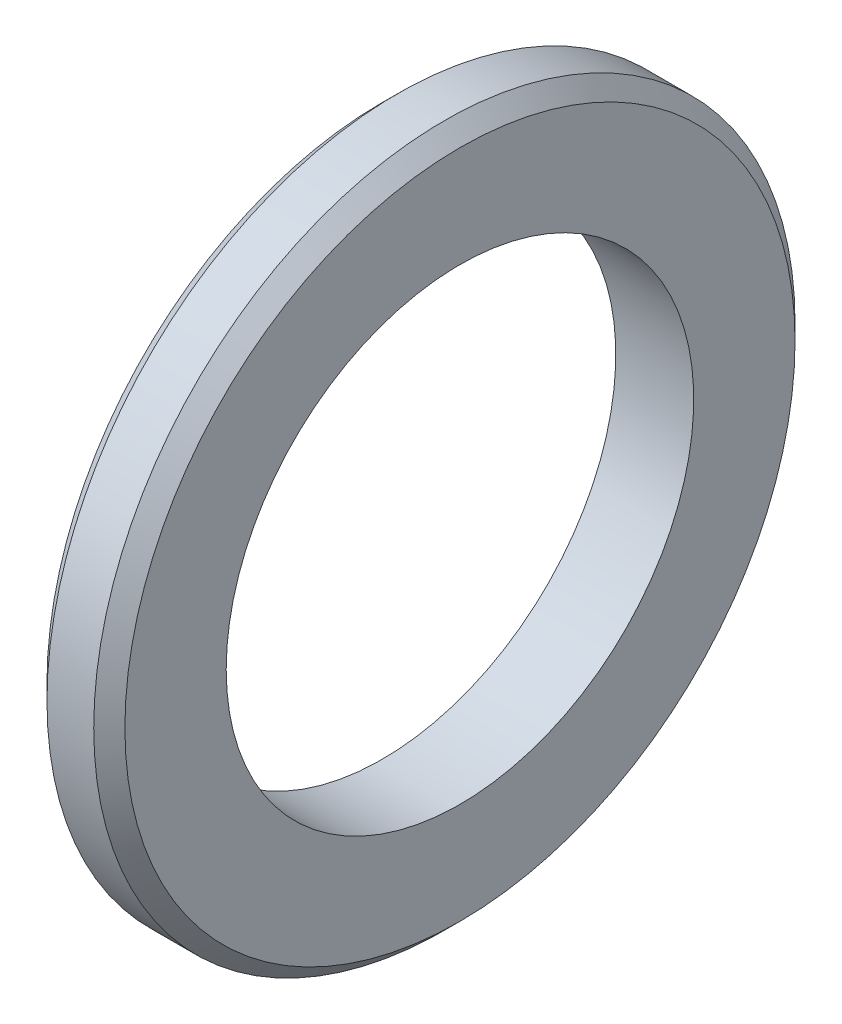
ISO-10303-21;
HEADER;
FILE_DESCRIPTION(('STEP AP214'),'2;1');
FILE_NAME('part.step','',(''),(''),'','','');
FILE_SCHEMA(('AUTOMOTIVE_DESIGN { 1 0 10303 214 1 1 1 1 }'));
ENDSEC;
DATA;
#1=APPLICATION_CONTEXT('core data for automotive mechanical design processes');
#2=APPLICATION_PROTOCOL_DEFINITION('international standard','automotive_design',2000,#1);
#3=PRODUCT_CONTEXT('',#1,'mechanical');
#4=PRODUCT('Part','Part','',(#3));
#5=PRODUCT_RELATED_PRODUCT_CATEGORY('part','',(#4));
#6=PRODUCT_DEFINITION_FORMATION('','',#4);
#7=PRODUCT_DEFINITION_CONTEXT('part definition',#1,'design');
#8=PRODUCT_DEFINITION('design','',#6,#7);
#9=PRODUCT_DEFINITION_SHAPE('','',#8);
#10=(LENGTH_UNIT() NAMED_UNIT(*) SI_UNIT(.MILLI.,.METRE.));
#11=(NAMED_UNIT(*) PLANE_ANGLE_UNIT() SI_UNIT($,.RADIAN.));
#12=(NAMED_UNIT(*) SI_UNIT($,.STERADIAN.) SOLID_ANGLE_UNIT());
#13=UNCERTAINTY_MEASURE_WITH_UNIT(LENGTH_MEASURE(1.E-05),#10,'distance_accuracy_value','');
#14=(GEOMETRIC_REPRESENTATION_CONTEXT(3) GLOBAL_UNCERTAINTY_ASSIGNED_CONTEXT((#13)) GLOBAL_UNIT_ASSIGNED_CONTEXT((#10,
#11,#12)) REPRESENTATION_CONTEXT('',''));
#15=CARTESIAN_POINT('',(0.,0.,0.));
#16=DIRECTION('',(0.,0.,1.));
#17=DIRECTION('',(1.,0.,0.));
#18=AXIS2_PLACEMENT_3D('',#15,#16,#17);
#19=CARTESIAN_POINT('',(0.2,0.,0.));
#20=DIRECTION('',(1.,0.,0.));
#21=DIRECTION('',(0.,0.,-1.));
#22=AXIS2_PLACEMENT_3D('',#19,#20,#21);
#23=CONICAL_SURFACE('',#22,4.5,0.785398163397449);
#24=CARTESIAN_POINT('',(0.,0.,0.));
#25=DIRECTION('',(-1.,0.,0.));
#26=DIRECTION('',(0.,0.,1.));
#27=AXIS2_PLACEMENT_3D('',#24,#25,#26);
#28=CIRCLE('',#27,4.3);
#29=CARTESIAN_POINT('',(0.,0.,4.3));
#30=VERTEX_POINT('',#29);
#31=EDGE_CURVE('E37',#30,#30,#28,.T.);
#32=ORIENTED_EDGE('',*,*,#31,.F.);
#33=EDGE_LOOP('',(#32));
#34=FACE_BOUND('',#33,.T.);
#35=CARTESIAN_POINT('',(0.2,0.,0.));
#36=DIRECTION('',(-1.,0.,0.));
#37=DIRECTION('',(0.,0.,1.));
#38=AXIS2_PLACEMENT_3D('',#35,#36,#37);
#39=CIRCLE('',#38,4.5);
#40=CARTESIAN_POINT('',(0.2,0.,4.5));
#41=VERTEX_POINT('',#40);
#42=EDGE_CURVE('E10',#41,#41,#39,.T.);
#43=ORIENTED_EDGE('',*,*,#42,.T.);
#44=EDGE_LOOP('',(#43));
#45=FACE_BOUND('',#44,.T.);
#46=ADVANCED_FACE('F15',(#34,#45),#23,.T.);
#47=CARTESIAN_POINT('',(1.,0.,0.));
#48=DIRECTION('',(-1.,0.,0.));
#49=DIRECTION('',(0.,0.,1.));
#50=AXIS2_PLACEMENT_3D('',#47,#48,#49);
#51=CYLINDRICAL_SURFACE('',#50,4.5);
#52=ORIENTED_EDGE('',*,*,#42,.F.);
#53=EDGE_LOOP('',(#52));
#54=FACE_BOUND('',#53,.T.);
#55=CARTESIAN_POINT('',(0.8,0.,0.));
#56=DIRECTION('',(-1.,0.,0.));
#57=DIRECTION('',(0.,0.,1.));
#58=AXIS2_PLACEMENT_3D('',#55,#56,#57);
#59=CIRCLE('',#58,4.5);
#60=CARTESIAN_POINT('',(0.8,0.,4.5));
#61=VERTEX_POINT('',#60);
#62=EDGE_CURVE('E21',#61,#61,#59,.T.);
#63=ORIENTED_EDGE('',*,*,#62,.T.);
#64=EDGE_LOOP('',(#63));
#65=FACE_BOUND('',#64,.T.);
#66=ADVANCED_FACE('F44',(#54,#65),#51,.T.);
#67=CARTESIAN_POINT('',(1.,0.,0.));
#68=DIRECTION('',(-1.,0.,0.));
#69=DIRECTION('',(0.,0.,1.));
#70=AXIS2_PLACEMENT_3D('',#67,#68,#69);
#71=CONICAL_SURFACE('',#70,4.3,0.785398163397448);
#72=ORIENTED_EDGE('',*,*,#62,.F.);
#73=EDGE_LOOP('',(#72));
#74=FACE_BOUND('',#73,.T.);
#75=CARTESIAN_POINT('',(1.,0.,0.));
#76=DIRECTION('',(-1.,0.,0.));
#77=DIRECTION('',(0.,0.,1.));
#78=AXIS2_PLACEMENT_3D('',#75,#76,#77);
#79=CIRCLE('',#78,4.3);
#80=CARTESIAN_POINT('',(1.,0.,4.3));
#81=VERTEX_POINT('',#80);
#82=EDGE_CURVE('E25',#81,#81,#79,.T.);
#83=ORIENTED_EDGE('',*,*,#82,.T.);
#84=EDGE_LOOP('',(#83));
#85=FACE_BOUND('',#84,.T.);
#86=ADVANCED_FACE('F50',(#74,#85),#71,.T.);
#87=CARTESIAN_POINT('',(1.,3.,0.));
#88=DIRECTION('',(-1.,0.,0.));
#89=DIRECTION('',(0.,0.,1.));
#90=AXIS2_PLACEMENT_3D('',#87,#88,#89);
#91=PLANE('',#90);
#92=ORIENTED_EDGE('',*,*,#82,.F.);
#93=EDGE_LOOP('',(#92));
#94=FACE_BOUND('',#93,.T.);
#95=CARTESIAN_POINT('',(1.,0.,0.));
#96=DIRECTION('',(-1.,0.,0.));
#97=DIRECTION('',(0.,0.,1.));
#98=AXIS2_PLACEMENT_3D('',#95,#96,#97);
#99=CIRCLE('',#98,3.);
#100=CARTESIAN_POINT('',(1.,0.,3.));
#101=VERTEX_POINT('',#100);
#102=EDGE_CURVE('E29',#101,#101,#99,.T.);
#103=ORIENTED_EDGE('',*,*,#102,.T.);
#104=EDGE_LOOP('',(#103));
#105=FACE_BOUND('',#104,.T.);
#106=ADVANCED_FACE('F56',(#94,#105),#91,.F.);
#107=CARTESIAN_POINT('',(1.,0.,0.));
#108=DIRECTION('',(-1.,0.,0.));
#109=DIRECTION('',(0.,0.,1.));
#110=AXIS2_PLACEMENT_3D('',#107,#108,#109);
#111=CYLINDRICAL_SURFACE('',#110,3.);
#112=ORIENTED_EDGE('',*,*,#102,.F.);
#113=EDGE_LOOP('',(#112));
#114=FACE_BOUND('',#113,.T.);
#115=CARTESIAN_POINT('',(0.,0.,0.));
#116=DIRECTION('',(-1.,0.,0.));
#117=DIRECTION('',(0.,0.,1.));
#118=AXIS2_PLACEMENT_3D('',#115,#116,#117);
#119=CIRCLE('',#118,3.);
#120=CARTESIAN_POINT('',(0.,0.,3.));
#121=VERTEX_POINT('',#120);
#122=EDGE_CURVE('E34',#121,#121,#119,.T.);
#123=ORIENTED_EDGE('',*,*,#122,.T.);
#124=EDGE_LOOP('',(#123));
#125=FACE_BOUND('',#124,.T.);
#126=ADVANCED_FACE('F62',(#114,#125),#111,.F.);
#127=CARTESIAN_POINT('',(0.,4.3,0.));
#128=DIRECTION('',(1.,0.,0.));
#129=DIRECTION('',(0.,0.,-1.));
#130=AXIS2_PLACEMENT_3D('',#127,#128,#129);
#131=PLANE('',#130);
#132=ORIENTED_EDGE('',*,*,#122,.F.);
#133=EDGE_LOOP('',(#132));
#134=FACE_BOUND('',#133,.T.);
#135=ORIENTED_EDGE('',*,*,#31,.T.);
#136=EDGE_LOOP('',(#135));
#137=FACE_BOUND('',#136,.T.);
#138=ADVANCED_FACE('F41',(#134,#137),#131,.F.);
#139=CLOSED_SHELL('',(#46,#66,#86,#106,#126,#138));
#140=MANIFOLD_SOLID_BREP('B1',#139);
#141=ADVANCED_BREP_SHAPE_REPRESENTATION('',(#18,#140),#14);
#142=SHAPE_DEFINITION_REPRESENTATION(#9,#141);
ENDSEC;
END-ISO-10303-21;
